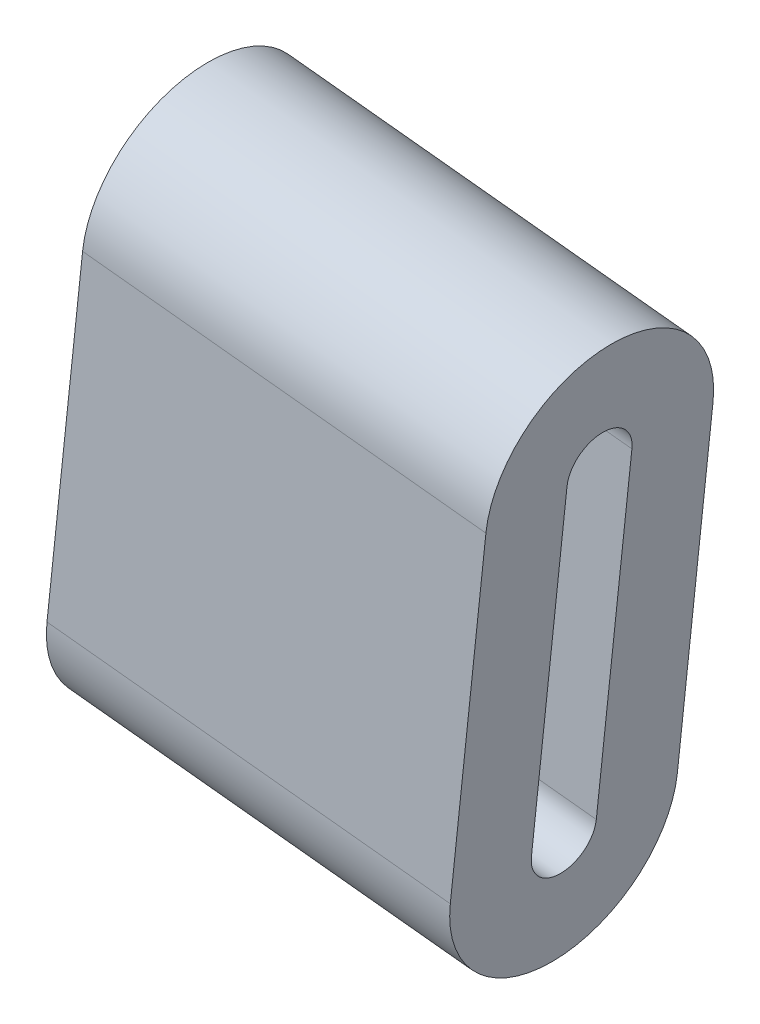
ISO-10303-21;
HEADER;
FILE_DESCRIPTION(('STEP AP214'),'2;1');
FILE_NAME('part.step','',(''),(''),'','','');
FILE_SCHEMA(('AUTOMOTIVE_DESIGN { 1 0 10303 214 1 1 1 1 }'));
ENDSEC;
DATA;
#1=APPLICATION_CONTEXT('core data for automotive mechanical design processes');
#2=APPLICATION_PROTOCOL_DEFINITION('international standard','automotive_design',2000,#1);
#3=PRODUCT_CONTEXT('',#1,'mechanical');
#4=PRODUCT('Part','Part','',(#3));
#5=PRODUCT_RELATED_PRODUCT_CATEGORY('part','',(#4));
#6=PRODUCT_DEFINITION_FORMATION('','',#4);
#7=PRODUCT_DEFINITION_CONTEXT('part definition',#1,'design');
#8=PRODUCT_DEFINITION('design','',#6,#7);
#9=PRODUCT_DEFINITION_SHAPE('','',#8);
#10=(LENGTH_UNIT() NAMED_UNIT(*) SI_UNIT(.MILLI.,.METRE.));
#11=(NAMED_UNIT(*) PLANE_ANGLE_UNIT() SI_UNIT($,.RADIAN.));
#12=(NAMED_UNIT(*) SI_UNIT($,.STERADIAN.) SOLID_ANGLE_UNIT());
#13=UNCERTAINTY_MEASURE_WITH_UNIT(LENGTH_MEASURE(1.E-05),#10,'distance_accuracy_value','');
#14=(GEOMETRIC_REPRESENTATION_CONTEXT(3) GLOBAL_UNCERTAINTY_ASSIGNED_CONTEXT((#13)) GLOBAL_UNIT_ASSIGNED_CONTEXT((#10,
#11,#12)) REPRESENTATION_CONTEXT('',''));
#15=CARTESIAN_POINT('',(0.,0.,0.));
#16=DIRECTION('',(0.,0.,1.));
#17=DIRECTION('',(1.,0.,0.));
#18=AXIS2_PLACEMENT_3D('',#15,#16,#17);
#19=CARTESIAN_POINT('',(27.1342545780166,4.38563760211495,-2.286));
#20=DIRECTION('',(0.994521895368274,-0.104528463267647,0.));
#21=DIRECTION('',(0.104528463267647,0.994521895368274,0.));
#22=AXIS2_PLACEMENT_3D('',#19,#20,#21);
#23=CYLINDRICAL_SURFACE('',#22,0.254000000000003);
#24=DIRECTION('',(-0.994521895368274,0.104528463267649,0.));
#25=VECTOR('',#24,1.);
#26=CARTESIAN_POINT('',(30.2918615958109,4.05375973124017,-2.54));
#27=LINE('',#26,#25);
#28=CARTESIAN_POINT('',(30.2918615958109,4.05375973124017,-2.54));
#29=VERTEX_POINT('',#28);
#30=CARTESIAN_POINT('',(27.1342545780166,4.38563760211496,-2.54));
#31=VERTEX_POINT('',#30);
#32=EDGE_CURVE('E91',#29,#31,#27,.T.);
#33=ORIENTED_EDGE('',*,*,#32,.T.);
#34=CARTESIAN_POINT('',(27.1342545780166,4.38563760211495,-2.286));
#35=DIRECTION('',(0.994521895368274,-0.104528463267647,0.));
#36=DIRECTION('',(0.104528463267647,0.994521895368274,0.));
#37=AXIS2_PLACEMENT_3D('',#34,#35,#36);
#38=CIRCLE('',#37,0.254000000000003);
#39=CARTESIAN_POINT('',(27.1342545780166,4.38563760211496,-2.032));
#40=VERTEX_POINT('',#39);
#41=EDGE_CURVE('E20',#40,#31,#38,.T.);
#42=ORIENTED_EDGE('',*,*,#41,.F.);
#43=DIRECTION('',(0.994521895368274,-0.104528463267649,0.));
#44=VECTOR('',#43,1.);
#45=CARTESIAN_POINT('',(27.1342545780166,4.38563760211495,-2.032));
#46=LINE('',#45,#44);
#47=CARTESIAN_POINT('',(30.2918615958109,4.05375973124017,-2.032));
#48=VERTEX_POINT('',#47);
#49=EDGE_CURVE('E96',#40,#48,#46,.T.);
#50=ORIENTED_EDGE('',*,*,#49,.T.);
#51=CARTESIAN_POINT('',(30.2918615958109,4.05375973124018,-2.286));
#52=DIRECTION('',(0.994521895368274,-0.104528463267647,0.));
#53=DIRECTION('',(0.104528463267647,0.994521895368274,0.));
#54=AXIS2_PLACEMENT_3D('',#51,#52,#53);
#55=CIRCLE('',#54,0.254000000000003);
#56=EDGE_CURVE('E89',#29,#48,#55,.F.);
#57=ORIENTED_EDGE('',*,*,#56,.F.);
#58=EDGE_LOOP('',(#33,#42,#50,#57));
#59=FACE_BOUND('',#58,.T.);
#60=ADVANCED_FACE('F17',(#59),#23,.F.);
#61=CARTESIAN_POINT('',(27.4130319895514,7.03802749706214,-2.286));
#62=DIRECTION('',(0.994521895368274,-0.104528463267647,0.));
#63=DIRECTION('',(0.104528463267647,0.994521895368274,0.));
#64=AXIS2_PLACEMENT_3D('',#61,#62,#63);
#65=CYLINDRICAL_SURFACE('',#64,0.254000000000003);
#66=DIRECTION('',(-0.994521895368274,0.104528463267646,0.));
#67=VECTOR('',#66,1.);
#68=CARTESIAN_POINT('',(30.5706390073457,6.70614962618736,-2.032));
#69=LINE('',#68,#67);
#70=CARTESIAN_POINT('',(30.5706390073457,6.70614962618736,-2.032));
#71=VERTEX_POINT('',#70);
#72=CARTESIAN_POINT('',(27.4130319895514,7.03802749706214,-2.032));
#73=VERTEX_POINT('',#72);
#74=EDGE_CURVE('E131',#71,#73,#69,.T.);
#75=ORIENTED_EDGE('',*,*,#74,.T.);
#76=CARTESIAN_POINT('',(27.4130319895514,7.03802749706214,-2.286));
#77=DIRECTION('',(0.994521895368274,-0.104528463267647,0.));
#78=DIRECTION('',(0.104528463267647,0.994521895368274,0.));
#79=AXIS2_PLACEMENT_3D('',#76,#77,#78);
#80=CIRCLE('',#79,0.254000000000003);
#81=CARTESIAN_POINT('',(27.4130319895514,7.03802749706214,-2.54));
#82=VERTEX_POINT('',#81);
#83=EDGE_CURVE('E143',#82,#73,#80,.T.);
#84=ORIENTED_EDGE('',*,*,#83,.F.);
#85=DIRECTION('',(0.994521895368275,-0.104528463267643,0.));
#86=VECTOR('',#85,1.);
#87=CARTESIAN_POINT('',(27.4130319895514,7.03802749706214,-2.54));
#88=LINE('',#87,#86);
#89=CARTESIAN_POINT('',(30.5706390073457,6.70614962618736,-2.54));
#90=VERTEX_POINT('',#89);
#91=EDGE_CURVE('E95',#82,#90,#88,.T.);
#92=ORIENTED_EDGE('',*,*,#91,.T.);
#93=CARTESIAN_POINT('',(30.5706390073457,6.70614962618736,-2.286));
#94=DIRECTION('',(0.994521895368274,-0.104528463267647,0.));
#95=DIRECTION('',(0.104528463267647,0.994521895368274,0.));
#96=AXIS2_PLACEMENT_3D('',#93,#94,#95);
#97=CIRCLE('',#96,0.254000000000003);
#98=EDGE_CURVE('E134',#71,#90,#97,.F.);
#99=ORIENTED_EDGE('',*,*,#98,.F.);
#100=EDGE_LOOP('',(#75,#84,#92,#99));
#101=FACE_BOUND('',#100,.T.);
#102=ADVANCED_FACE('F151',(#101),#65,.F.);
#103=CARTESIAN_POINT('',(27.1342545780166,4.38563760211495,-2.032));
#104=DIRECTION('',(0.,0.,1.));
#105=DIRECTION('',(0.,-1.,0.));
#106=AXIS2_PLACEMENT_3D('',#103,#104,#105);
#107=PLANE('',#106);
#108=ORIENTED_EDGE('',*,*,#49,.F.);
#109=DIRECTION('',(-0.104528463267647,-0.994521895368274,0.));
#110=VECTOR('',#109,1.);
#111=CARTESIAN_POINT('',(27.4130319895514,7.03802749706214,-2.032));
#112=LINE('',#111,#110);
#113=EDGE_CURVE('E88',#73,#40,#112,.T.);
#114=ORIENTED_EDGE('',*,*,#113,.F.);
#115=ORIENTED_EDGE('',*,*,#74,.F.);
#116=DIRECTION('',(-0.104528463267647,-0.994521895368274,0.));
#117=VECTOR('',#116,1.);
#118=CARTESIAN_POINT('',(30.5706390073457,6.70614962618736,-2.032));
#119=LINE('',#118,#117);
#120=EDGE_CURVE('E120',#71,#48,#119,.T.);
#121=ORIENTED_EDGE('',*,*,#120,.T.);
#122=EDGE_LOOP('',(#108,#114,#115,#121));
#123=FACE_BOUND('',#122,.T.);
#124=ADVANCED_FACE('F149',(#123),#107,.F.);
#125=CARTESIAN_POINT('',(27.1342545780166,4.38563760211495,-2.54));
#126=DIRECTION('',(0.,0.,-1.));
#127=DIRECTION('',(0.,1.,0.));
#128=AXIS2_PLACEMENT_3D('',#125,#126,#127);
#129=PLANE('',#128);
#130=ORIENTED_EDGE('',*,*,#91,.F.);
#131=DIRECTION('',(-0.104528463267647,-0.994521895368274,0.));
#132=VECTOR('',#131,1.);
#133=CARTESIAN_POINT('',(27.4130319895514,7.03802749706214,-2.54));
#134=LINE('',#133,#132);
#135=EDGE_CURVE('E86',#31,#82,#134,.F.);
#136=ORIENTED_EDGE('',*,*,#135,.F.);
#137=ORIENTED_EDGE('',*,*,#32,.F.);
#138=DIRECTION('',(-0.104528463267647,-0.994521895368274,0.));
#139=VECTOR('',#138,1.);
#140=CARTESIAN_POINT('',(30.5706390073457,6.70614962618736,-2.54));
#141=LINE('',#140,#139);
#142=EDGE_CURVE('E123',#29,#90,#141,.F.);
#143=ORIENTED_EDGE('',*,*,#142,.T.);
#144=EDGE_LOOP('',(#130,#136,#137,#143));
#145=FACE_BOUND('',#144,.T.);
#146=ADVANCED_FACE('F99',(#145),#129,.F.);
#147=CARTESIAN_POINT('',(27.1342545780166,4.38563760211495,-2.286));
#148=DIRECTION('',(0.994521895368274,-0.104528463267647,0.));
#149=DIRECTION('',(0.104528463267647,0.994521895368274,0.));
#150=AXIS2_PLACEMENT_3D('',#147,#148,#149);
#151=CYLINDRICAL_SURFACE('',#150,0.889);
#152=CARTESIAN_POINT('',(27.1342545780166,4.38563760211495,-2.286));
#153=DIRECTION('',(0.994521895368274,-0.104528463267647,0.));
#154=DIRECTION('',(0.104528463267647,0.994521895368274,0.));
#155=AXIS2_PLACEMENT_3D('',#152,#153,#154);
#156=CIRCLE('',#155,0.889);
#157=CARTESIAN_POINT('',(27.1342545780166,4.38563760211495,-3.175));
#158=VERTEX_POINT('',#157);
#159=CARTESIAN_POINT('',(27.1342545780166,4.38563760211495,-1.397));
#160=VERTEX_POINT('',#159);
#161=EDGE_CURVE('E104',#158,#160,#156,.F.);
#162=ORIENTED_EDGE('',*,*,#161,.F.);
#163=DIRECTION('',(-0.994521895368274,0.104528463267649,0.));
#164=VECTOR('',#163,1.);
#165=CARTESIAN_POINT('',(30.2918615958109,4.05375973124017,-3.175));
#166=LINE('',#165,#164);
#167=CARTESIAN_POINT('',(30.2918615958109,4.05375973124017,-3.175));
#168=VERTEX_POINT('',#167);
#169=EDGE_CURVE('E106',#168,#158,#166,.T.);
#170=ORIENTED_EDGE('',*,*,#169,.F.);
#171=CARTESIAN_POINT('',(30.2918615958109,4.05375973124018,-2.286));
#172=DIRECTION('',(0.994521895368274,-0.104528463267647,0.));
#173=DIRECTION('',(0.104528463267647,0.994521895368274,0.));
#174=AXIS2_PLACEMENT_3D('',#171,#172,#173);
#175=CIRCLE('',#174,0.889);
#176=CARTESIAN_POINT('',(30.2918615958109,4.05375973124017,-1.397));
#177=VERTEX_POINT('',#176);
#178=EDGE_CURVE('E119',#168,#177,#175,.F.);
#179=ORIENTED_EDGE('',*,*,#178,.T.);
#180=DIRECTION('',(0.994521895368274,-0.104528463267649,0.));
#181=VECTOR('',#180,1.);
#182=CARTESIAN_POINT('',(27.1342545780166,4.38563760211495,-1.397));
#183=LINE('',#182,#181);
#184=EDGE_CURVE('E114',#160,#177,#183,.T.);
#185=ORIENTED_EDGE('',*,*,#184,.F.);
#186=EDGE_LOOP('',(#162,#170,#179,#185));
#187=FACE_BOUND('',#186,.T.);
#188=ADVANCED_FACE('F178',(#187),#151,.T.);
#189=CARTESIAN_POINT('',(30.5706390073457,6.70614962618736,-2.286));
#190=DIRECTION('',(-0.994521895368274,0.104528463267647,0.));
#191=DIRECTION('',(-0.104528463267647,-0.994521895368274,0.));
#192=AXIS2_PLACEMENT_3D('',#189,#190,#191);
#193=PLANE('',#192);
#194=DIRECTION('',(0.104528463267641,0.994521895368275,0.));
#195=VECTOR('',#194,1.);
#196=CARTESIAN_POINT('',(30.2918615958109,4.05375973124017,-1.397));
#197=LINE('',#196,#195);
#198=CARTESIAN_POINT('',(30.5706390073457,6.70614962618736,-1.397));
#199=VERTEX_POINT('',#198);
#200=EDGE_CURVE('E115',#177,#199,#197,.T.);
#201=ORIENTED_EDGE('',*,*,#200,.F.);
#202=ORIENTED_EDGE('',*,*,#178,.F.);
#203=DIRECTION('',(-0.104528463267641,-0.994521895368275,0.));
#204=VECTOR('',#203,1.);
#205=CARTESIAN_POINT('',(30.5706390073457,6.70614962618736,-3.175));
#206=LINE('',#205,#204);
#207=CARTESIAN_POINT('',(30.5706390073457,6.70614962618736,-3.175));
#208=VERTEX_POINT('',#207);
#209=EDGE_CURVE('E116',#208,#168,#206,.T.);
#210=ORIENTED_EDGE('',*,*,#209,.F.);
#211=CARTESIAN_POINT('',(30.5706390073457,6.70614962618736,-2.286));
#212=DIRECTION('',(0.994521895368274,-0.104528463267647,0.));
#213=DIRECTION('',(0.104528463267647,0.994521895368274,0.));
#214=AXIS2_PLACEMENT_3D('',#211,#212,#213);
#215=CIRCLE('',#214,0.889);
#216=EDGE_CURVE('E111',#199,#208,#215,.F.);
#217=ORIENTED_EDGE('',*,*,#216,.F.);
#218=EDGE_LOOP('',(#201,#202,#210,#217));
#219=FACE_BOUND('',#218,.T.);
#220=ORIENTED_EDGE('',*,*,#98,.T.);
#221=ORIENTED_EDGE('',*,*,#142,.F.);
#222=ORIENTED_EDGE('',*,*,#56,.T.);
#223=ORIENTED_EDGE('',*,*,#120,.F.);
#224=EDGE_LOOP('',(#220,#221,#222,#223));
#225=FACE_BOUND('',#224,.T.);
#226=ADVANCED_FACE('F146',(#219,#225),#193,.F.);
#227=CARTESIAN_POINT('',(27.1342545780166,4.38563760211495,-3.175));
#228=DIRECTION('',(0.,0.,-1.));
#229=DIRECTION('',(0.,1.,0.));
#230=AXIS2_PLACEMENT_3D('',#227,#228,#229);
#231=PLANE('',#230);
#232=DIRECTION('',(-0.104528463267647,-0.994521895368274,0.));
#233=VECTOR('',#232,1.);
#234=CARTESIAN_POINT('',(27.4130319895514,7.03802749706214,-3.175));
#235=LINE('',#234,#233);
#236=CARTESIAN_POINT('',(27.4130319895514,7.03802749706214,-3.175));
#237=VERTEX_POINT('',#236);
#238=EDGE_CURVE('E101',#237,#158,#235,.T.);
#239=ORIENTED_EDGE('',*,*,#238,.F.);
#240=DIRECTION('',(0.994521895368274,-0.104528463267647,0.));
#241=VECTOR('',#240,1.);
#242=CARTESIAN_POINT('',(27.4130319895514,7.03802749706214,-3.175));
#243=LINE('',#242,#241);
#244=EDGE_CURVE('E109',#208,#237,#243,.F.);
#245=ORIENTED_EDGE('',*,*,#244,.F.);
#246=ORIENTED_EDGE('',*,*,#209,.T.);
#247=ORIENTED_EDGE('',*,*,#169,.T.);
#248=EDGE_LOOP('',(#239,#245,#246,#247));
#249=FACE_BOUND('',#248,.T.);
#250=ADVANCED_FACE('F172',(#249),#231,.T.);
#251=CARTESIAN_POINT('',(27.4130319895514,7.03802749706214,-2.286));
#252=DIRECTION('',(-0.994521895368274,0.104528463267647,0.));
#253=DIRECTION('',(-0.104528463267647,-0.994521895368274,0.));
#254=AXIS2_PLACEMENT_3D('',#251,#252,#253);
#255=PLANE('',#254);
#256=ORIENTED_EDGE('',*,*,#161,.T.);
#257=DIRECTION('',(-0.104528463267642,-0.994521895368275,0.));
#258=VECTOR('',#257,1.);
#259=CARTESIAN_POINT('',(27.4130319895514,7.03802749706213,-1.397));
#260=LINE('',#259,#258);
#261=CARTESIAN_POINT('',(27.4130319895514,7.03802749706213,-1.397));
#262=VERTEX_POINT('',#261);
#263=EDGE_CURVE('E35',#262,#160,#260,.T.);
#264=ORIENTED_EDGE('',*,*,#263,.F.);
#265=CARTESIAN_POINT('',(27.4130319895514,7.03802749706214,-2.286));
#266=DIRECTION('',(0.994521895368274,-0.104528463267647,0.));
#267=DIRECTION('',(0.104528463267647,0.994521895368274,0.));
#268=AXIS2_PLACEMENT_3D('',#265,#266,#267);
#269=CIRCLE('',#268,0.889);
#270=EDGE_CURVE('E26',#237,#262,#269,.T.);
#271=ORIENTED_EDGE('',*,*,#270,.F.);
#272=ORIENTED_EDGE('',*,*,#238,.T.);
#273=EDGE_LOOP('',(#256,#264,#271,#272));
#274=FACE_BOUND('',#273,.T.);
#275=ORIENTED_EDGE('',*,*,#41,.T.);
#276=ORIENTED_EDGE('',*,*,#135,.T.);
#277=ORIENTED_EDGE('',*,*,#83,.T.);
#278=ORIENTED_EDGE('',*,*,#113,.T.);
#279=EDGE_LOOP('',(#275,#276,#277,#278));
#280=FACE_BOUND('',#279,.T.);
#281=ADVANCED_FACE('F84',(#274,#280),#255,.T.);
#282=CARTESIAN_POINT('',(27.1342545780166,4.38563760211495,-1.397));
#283=DIRECTION('',(0.,0.,1.));
#284=DIRECTION('',(0.,-1.,0.));
#285=AXIS2_PLACEMENT_3D('',#282,#283,#284);
#286=PLANE('',#285);
#287=ORIENTED_EDGE('',*,*,#263,.T.);
#288=ORIENTED_EDGE('',*,*,#184,.T.);
#289=ORIENTED_EDGE('',*,*,#200,.T.);
#290=DIRECTION('',(0.994521895368274,-0.104528463267647,0.));
#291=VECTOR('',#290,1.);
#292=CARTESIAN_POINT('',(27.4130319895514,7.03802749706214,-1.397));
#293=LINE('',#292,#291);
#294=EDGE_CURVE('E11',#262,#199,#293,.T.);
#295=ORIENTED_EDGE('',*,*,#294,.F.);
#296=EDGE_LOOP('',(#287,#288,#289,#295));
#297=FACE_BOUND('',#296,.T.);
#298=ADVANCED_FACE('F161',(#297),#286,.T.);
#299=CARTESIAN_POINT('',(27.4130319895514,7.03802749706214,-2.286));
#300=DIRECTION('',(0.994521895368274,-0.104528463267647,0.));
#301=DIRECTION('',(0.104528463267647,0.994521895368274,0.));
#302=AXIS2_PLACEMENT_3D('',#299,#300,#301);
#303=CYLINDRICAL_SURFACE('',#302,0.889);
#304=ORIENTED_EDGE('',*,*,#270,.T.);
#305=ORIENTED_EDGE('',*,*,#294,.T.);
#306=ORIENTED_EDGE('',*,*,#216,.T.);
#307=ORIENTED_EDGE('',*,*,#244,.T.);
#308=EDGE_LOOP('',(#304,#305,#306,#307));
#309=FACE_BOUND('',#308,.T.);
#310=ADVANCED_FACE('F159',(#309),#303,.T.);
#311=CLOSED_SHELL('',(#60,#102,#124,#146,#188,#226,#250,#281,#298,#310));
#312=MANIFOLD_SOLID_BREP('B1',#311);
#313=ADVANCED_BREP_SHAPE_REPRESENTATION('',(#18,#312),#14);
#314=SHAPE_DEFINITION_REPRESENTATION(#9,#313);
ENDSEC;
END-ISO-10303-21;
